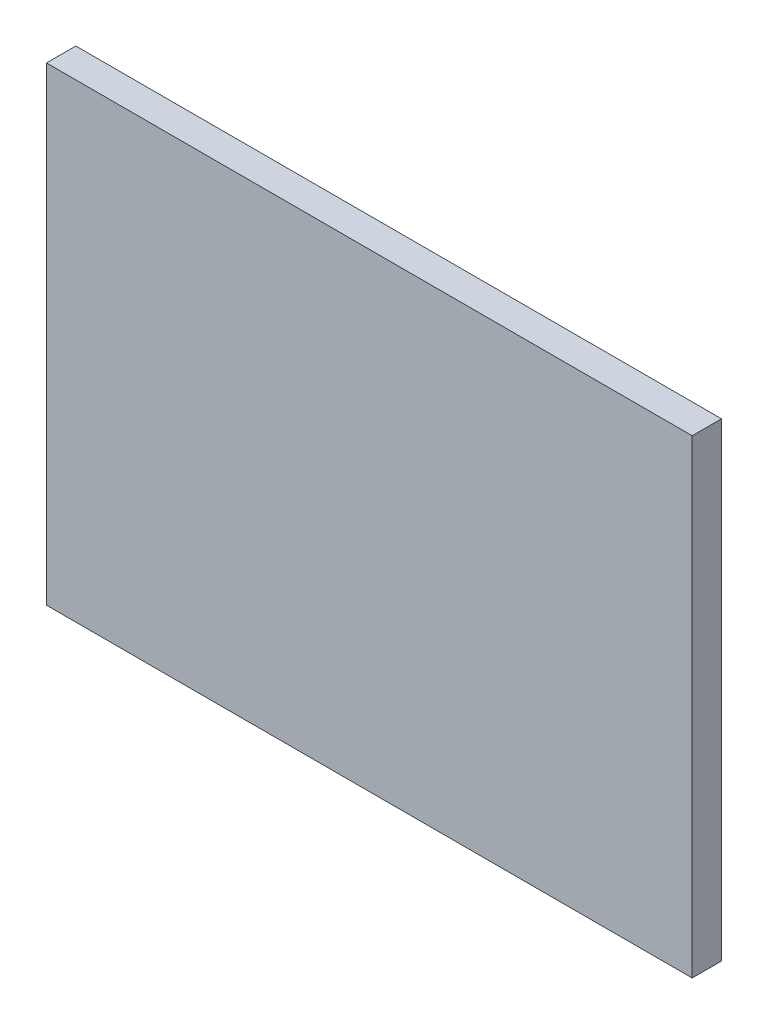
ISO-10303-21;
HEADER;
FILE_DESCRIPTION(('STEP AP214'),'2;1');
FILE_NAME('part.step','',(''),(''),'','','');
FILE_SCHEMA(('AUTOMOTIVE_DESIGN { 1 0 10303 214 1 1 1 1 }'));
ENDSEC;
DATA;
#1=APPLICATION_CONTEXT('core data for automotive mechanical design processes');
#2=APPLICATION_PROTOCOL_DEFINITION('international standard','automotive_design',2000,#1);
#3=PRODUCT_CONTEXT('',#1,'mechanical');
#4=PRODUCT('Part','Part','',(#3));
#5=PRODUCT_RELATED_PRODUCT_CATEGORY('part','',(#4));
#6=PRODUCT_DEFINITION_FORMATION('','',#4);
#7=PRODUCT_DEFINITION_CONTEXT('part definition',#1,'design');
#8=PRODUCT_DEFINITION('design','',#6,#7);
#9=PRODUCT_DEFINITION_SHAPE('','',#8);
#10=(LENGTH_UNIT() NAMED_UNIT(*) SI_UNIT(.MILLI.,.METRE.));
#11=(NAMED_UNIT(*) PLANE_ANGLE_UNIT() SI_UNIT($,.RADIAN.));
#12=(NAMED_UNIT(*) SI_UNIT($,.STERADIAN.) SOLID_ANGLE_UNIT());
#13=UNCERTAINTY_MEASURE_WITH_UNIT(LENGTH_MEASURE(1.E-05),#10,'distance_accuracy_value','');
#14=(GEOMETRIC_REPRESENTATION_CONTEXT(3) GLOBAL_UNCERTAINTY_ASSIGNED_CONTEXT((#13)) GLOBAL_UNIT_ASSIGNED_CONTEXT((#10,
#11,#12)) REPRESENTATION_CONTEXT('',''));
#15=CARTESIAN_POINT('',(0.,0.,0.));
#16=DIRECTION('',(0.,0.,1.));
#17=DIRECTION('',(1.,0.,0.));
#18=AXIS2_PLACEMENT_3D('',#15,#16,#17);
#19=CARTESIAN_POINT('',(69.85,-50.8,6.35));
#20=DIRECTION('',(-1.,0.,0.));
#21=DIRECTION('',(0.,0.,1.));
#22=AXIS2_PLACEMENT_3D('',#19,#20,#21);
#23=PLANE('',#22);
#24=DIRECTION('',(0.,1.,0.));
#25=VECTOR('',#24,1.);
#26=CARTESIAN_POINT('',(69.85,-50.8,0.));
#27=LINE('',#26,#25);
#28=CARTESIAN_POINT('',(69.85,-50.8,0.));
#29=VERTEX_POINT('',#28);
#30=CARTESIAN_POINT('',(69.85,50.8,0.));
#31=VERTEX_POINT('',#30);
#32=EDGE_CURVE('E111',#29,#31,#27,.T.);
#33=ORIENTED_EDGE('',*,*,#32,.T.);
#34=DIRECTION('',(0.,0.,-1.));
#35=VECTOR('',#34,1.);
#36=CARTESIAN_POINT('',(69.85,50.8,6.35));
#37=LINE('',#36,#35);
#38=CARTESIAN_POINT('',(69.85,50.8,6.35));
#39=VERTEX_POINT('',#38);
#40=EDGE_CURVE('E11',#39,#31,#37,.T.);
#41=ORIENTED_EDGE('',*,*,#40,.F.);
#42=DIRECTION('',(0.,1.,0.));
#43=VECTOR('',#42,1.);
#44=CARTESIAN_POINT('',(69.85,-50.8,6.35));
#45=LINE('',#44,#43);
#46=CARTESIAN_POINT('',(69.85,-50.8,6.35));
#47=VERTEX_POINT('',#46);
#48=EDGE_CURVE('E95',#47,#39,#45,.T.);
#49=ORIENTED_EDGE('',*,*,#48,.F.);
#50=DIRECTION('',(0.,0.,-1.));
#51=VECTOR('',#50,1.);
#52=CARTESIAN_POINT('',(69.85,-50.8,6.35));
#53=LINE('',#52,#51);
#54=EDGE_CURVE('E107',#47,#29,#53,.T.);
#55=ORIENTED_EDGE('',*,*,#54,.T.);
#56=EDGE_LOOP('',(#33,#41,#49,#55));
#57=FACE_BOUND('',#56,.T.);
#58=ADVANCED_FACE('F43',(#57),#23,.F.);
#59=CARTESIAN_POINT('',(-69.85,50.8,6.35));
#60=DIRECTION('',(0.,-1.,0.));
#61=DIRECTION('',(0.,0.,-1.));
#62=AXIS2_PLACEMENT_3D('',#59,#60,#61);
#63=PLANE('',#62);
#64=DIRECTION('',(-1.,0.,0.));
#65=VECTOR('',#64,1.);
#66=CARTESIAN_POINT('',(-69.85,50.8,0.));
#67=LINE('',#66,#65);
#68=CARTESIAN_POINT('',(-69.85,50.8,0.));
#69=VERTEX_POINT('',#68);
#70=EDGE_CURVE('E100',#31,#69,#67,.T.);
#71=ORIENTED_EDGE('',*,*,#70,.T.);
#72=DIRECTION('',(0.,0.,-1.));
#73=VECTOR('',#72,1.);
#74=CARTESIAN_POINT('',(-69.85,50.8,6.35));
#75=LINE('',#74,#73);
#76=CARTESIAN_POINT('',(-69.85,50.8,6.35));
#77=VERTEX_POINT('',#76);
#78=EDGE_CURVE('E52',#77,#69,#75,.T.);
#79=ORIENTED_EDGE('',*,*,#78,.F.);
#80=DIRECTION('',(-1.,0.,0.));
#81=VECTOR('',#80,1.);
#82=CARTESIAN_POINT('',(-69.85,50.8,6.35));
#83=LINE('',#82,#81);
#84=EDGE_CURVE('E90',#39,#77,#83,.T.);
#85=ORIENTED_EDGE('',*,*,#84,.F.);
#86=ORIENTED_EDGE('',*,*,#40,.T.);
#87=EDGE_LOOP('',(#71,#79,#85,#86));
#88=FACE_BOUND('',#87,.T.);
#89=ADVANCED_FACE('F99',(#88),#63,.F.);
#90=CARTESIAN_POINT('',(-69.85,-50.8,6.35));
#91=DIRECTION('',(1.,0.,0.));
#92=DIRECTION('',(0.,0.,-1.));
#93=AXIS2_PLACEMENT_3D('',#90,#91,#92);
#94=PLANE('',#93);
#95=DIRECTION('',(0.,-1.,0.));
#96=VECTOR('',#95,1.);
#97=CARTESIAN_POINT('',(-69.85,-50.8,0.));
#98=LINE('',#97,#96);
#99=CARTESIAN_POINT('',(-69.85,-50.8,0.));
#100=VERTEX_POINT('',#99);
#101=EDGE_CURVE('E77',#69,#100,#98,.T.);
#102=ORIENTED_EDGE('',*,*,#101,.T.);
#103=DIRECTION('',(0.,0.,-1.));
#104=VECTOR('',#103,1.);
#105=CARTESIAN_POINT('',(-69.85,-50.8,6.35));
#106=LINE('',#105,#104);
#107=CARTESIAN_POINT('',(-69.85,-50.8,6.35));
#108=VERTEX_POINT('',#107);
#109=EDGE_CURVE('E102',#108,#100,#106,.T.);
#110=ORIENTED_EDGE('',*,*,#109,.F.);
#111=DIRECTION('',(0.,-1.,0.));
#112=VECTOR('',#111,1.);
#113=CARTESIAN_POINT('',(-69.85,-50.8,6.35));
#114=LINE('',#113,#112);
#115=EDGE_CURVE('E93',#77,#108,#114,.T.);
#116=ORIENTED_EDGE('',*,*,#115,.F.);
#117=ORIENTED_EDGE('',*,*,#78,.T.);
#118=EDGE_LOOP('',(#102,#110,#116,#117));
#119=FACE_BOUND('',#118,.T.);
#120=ADVANCED_FACE('F103',(#119),#94,.F.);
#121=CARTESIAN_POINT('',(-69.85,-50.8,6.35));
#122=DIRECTION('',(0.,1.,0.));
#123=DIRECTION('',(0.,0.,1.));
#124=AXIS2_PLACEMENT_3D('',#121,#122,#123);
#125=PLANE('',#124);
#126=DIRECTION('',(1.,0.,0.));
#127=VECTOR('',#126,1.);
#128=CARTESIAN_POINT('',(-69.85,-50.8,0.));
#129=LINE('',#128,#127);
#130=EDGE_CURVE('E83',#100,#29,#129,.T.);
#131=ORIENTED_EDGE('',*,*,#130,.T.);
#132=ORIENTED_EDGE('',*,*,#54,.F.);
#133=DIRECTION('',(1.,0.,0.));
#134=VECTOR('',#133,1.);
#135=CARTESIAN_POINT('',(-69.85,-50.8,6.35));
#136=LINE('',#135,#134);
#137=EDGE_CURVE('E60',#108,#47,#136,.T.);
#138=ORIENTED_EDGE('',*,*,#137,.F.);
#139=ORIENTED_EDGE('',*,*,#109,.T.);
#140=EDGE_LOOP('',(#131,#132,#138,#139));
#141=FACE_BOUND('',#140,.T.);
#142=ADVANCED_FACE('F124',(#141),#125,.F.);
#143=CARTESIAN_POINT('',(0.,0.,6.35));
#144=DIRECTION('',(0.,0.,-1.));
#145=DIRECTION('',(-1.,0.,0.));
#146=AXIS2_PLACEMENT_3D('',#143,#144,#145);
#147=PLANE('',#146);
#148=ORIENTED_EDGE('',*,*,#48,.T.);
#149=ORIENTED_EDGE('',*,*,#84,.T.);
#150=ORIENTED_EDGE('',*,*,#115,.T.);
#151=ORIENTED_EDGE('',*,*,#137,.T.);
#152=EDGE_LOOP('',(#148,#149,#150,#151));
#153=FACE_BOUND('',#152,.T.);
#154=ADVANCED_FACE('F91',(#153),#147,.F.);
#155=CARTESIAN_POINT('',(0.,0.,0.));
#156=DIRECTION('',(0.,0.,-1.));
#157=DIRECTION('',(-1.,0.,0.));
#158=AXIS2_PLACEMENT_3D('',#155,#156,#157);
#159=PLANE('',#158);
#160=ORIENTED_EDGE('',*,*,#32,.F.);
#161=ORIENTED_EDGE('',*,*,#130,.F.);
#162=ORIENTED_EDGE('',*,*,#101,.F.);
#163=ORIENTED_EDGE('',*,*,#70,.F.);
#164=EDGE_LOOP('',(#160,#161,#162,#163));
#165=FACE_BOUND('',#164,.T.);
#166=ADVANCED_FACE('F127',(#165),#159,.T.);
#167=CLOSED_SHELL('',(#58,#89,#120,#142,#154,#166));
#168=MANIFOLD_SOLID_BREP('B2',#167);
#169=ADVANCED_BREP_SHAPE_REPRESENTATION('',(#18,#168),#14);
#170=SHAPE_DEFINITION_REPRESENTATION(#9,#169);
ENDSEC;
END-ISO-10303-21;
